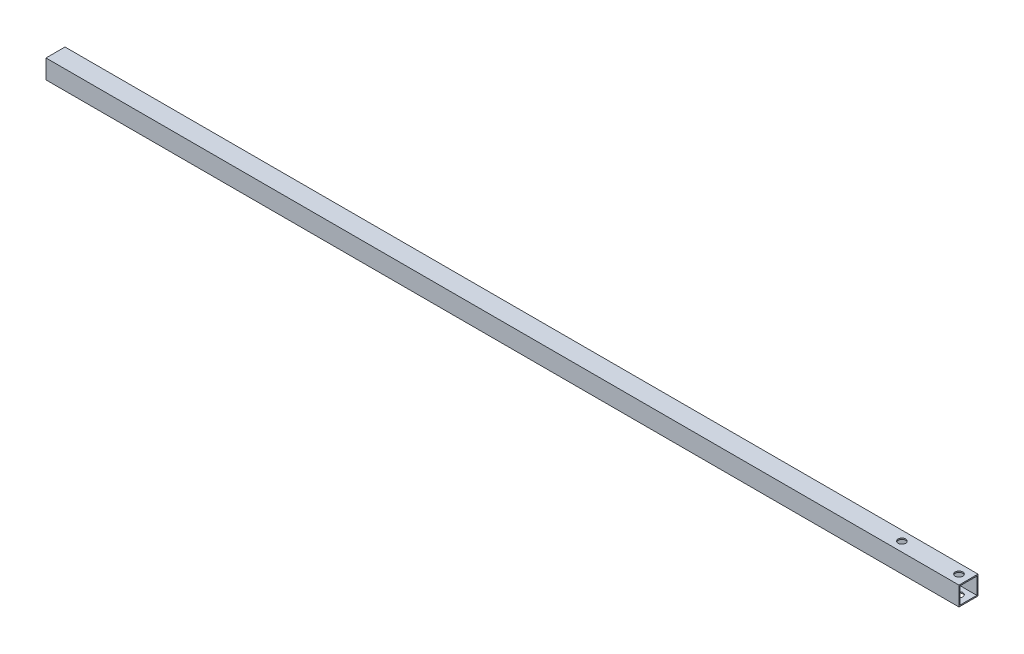
ISO-10303-21;
HEADER;
FILE_DESCRIPTION(('STEP AP214'),'2;1');
FILE_NAME('part.step','',(''),(''),'','','');
FILE_SCHEMA(('AUTOMOTIVE_DESIGN { 1 0 10303 214 1 1 1 1 }'));
ENDSEC;
DATA;
#1=APPLICATION_CONTEXT('core data for automotive mechanical design processes');
#2=APPLICATION_PROTOCOL_DEFINITION('international standard','automotive_design',2000,#1);
#3=PRODUCT_CONTEXT('',#1,'mechanical');
#4=PRODUCT('Part','Part','',(#3));
#5=PRODUCT_RELATED_PRODUCT_CATEGORY('part','',(#4));
#6=PRODUCT_DEFINITION_FORMATION('','',#4);
#7=PRODUCT_DEFINITION_CONTEXT('part definition',#1,'design');
#8=PRODUCT_DEFINITION('design','',#6,#7);
#9=PRODUCT_DEFINITION_SHAPE('','',#8);
#10=(LENGTH_UNIT() NAMED_UNIT(*) SI_UNIT(.MILLI.,.METRE.));
#11=(NAMED_UNIT(*) PLANE_ANGLE_UNIT() SI_UNIT($,.RADIAN.));
#12=(NAMED_UNIT(*) SI_UNIT($,.STERADIAN.) SOLID_ANGLE_UNIT());
#13=UNCERTAINTY_MEASURE_WITH_UNIT(LENGTH_MEASURE(1.E-05),#10,'distance_accuracy_value','');
#14=(GEOMETRIC_REPRESENTATION_CONTEXT(3) GLOBAL_UNCERTAINTY_ASSIGNED_CONTEXT((#13)) GLOBAL_UNIT_ASSIGNED_CONTEXT((#10,
#11,#12)) REPRESENTATION_CONTEXT('',''));
#15=CARTESIAN_POINT('',(0.,0.,0.));
#16=DIRECTION('',(0.,0.,1.));
#17=DIRECTION('',(1.,0.,0.));
#18=AXIS2_PLACEMENT_3D('',#15,#16,#17);
#19=CARTESIAN_POINT('',(1219.2,0.,0.));
#20=DIRECTION('',(-1.,0.,0.));
#21=DIRECTION('',(0.,0.,1.));
#22=AXIS2_PLACEMENT_3D('',#19,#20,#21);
#23=PLANE('',#22);
#24=DIRECTION('',(0.,1.,0.));
#25=VECTOR('',#24,1.);
#26=CARTESIAN_POINT('',(1219.2,-12.7,-12.7));
#27=LINE('',#26,#25);
#28=CARTESIAN_POINT('',(1219.2,-12.7,-12.7));
#29=VERTEX_POINT('',#28);
#30=CARTESIAN_POINT('',(1219.2,12.7,-12.7));
#31=VERTEX_POINT('',#30);
#32=EDGE_CURVE('E156',#29,#31,#27,.T.);
#33=ORIENTED_EDGE('',*,*,#32,.T.);
#34=DIRECTION('',(0.,0.,1.));
#35=VECTOR('',#34,1.);
#36=CARTESIAN_POINT('',(1219.2,12.7,12.7));
#37=LINE('',#36,#35);
#38=CARTESIAN_POINT('',(1219.2,12.7,12.7));
#39=VERTEX_POINT('',#38);
#40=EDGE_CURVE('E160',#31,#39,#37,.T.);
#41=ORIENTED_EDGE('',*,*,#40,.T.);
#42=DIRECTION('',(0.,-1.,0.));
#43=VECTOR('',#42,1.);
#44=CARTESIAN_POINT('',(1219.2,-12.7,12.7));
#45=LINE('',#44,#43);
#46=CARTESIAN_POINT('',(1219.2,-12.7,12.7));
#47=VERTEX_POINT('',#46);
#48=EDGE_CURVE('E164',#39,#47,#45,.T.);
#49=ORIENTED_EDGE('',*,*,#48,.T.);
#50=DIRECTION('',(0.,0.,-1.));
#51=VECTOR('',#50,1.);
#52=CARTESIAN_POINT('',(1219.2,-12.7,12.7));
#53=LINE('',#52,#51);
#54=EDGE_CURVE('E167',#47,#29,#53,.T.);
#55=ORIENTED_EDGE('',*,*,#54,.T.);
#56=EDGE_LOOP('',(#33,#41,#49,#55));
#57=FACE_BOUND('',#56,.T.);
#58=DIRECTION('',(0.,0.,-1.));
#59=VECTOR('',#58,1.);
#60=CARTESIAN_POINT('',(1219.2,-11.1125,11.1125));
#61=LINE('',#60,#59);
#62=CARTESIAN_POINT('',(1219.2,-11.1125,11.1125));
#63=VERTEX_POINT('',#62);
#64=CARTESIAN_POINT('',(1219.2,-11.1125,-11.1125));
#65=VERTEX_POINT('',#64);
#66=EDGE_CURVE('E106',#63,#65,#61,.T.);
#67=ORIENTED_EDGE('',*,*,#66,.F.);
#68=DIRECTION('',(0.,-1.,0.));
#69=VECTOR('',#68,1.);
#70=CARTESIAN_POINT('',(1219.2,-11.1125,11.1125));
#71=LINE('',#70,#69);
#72=CARTESIAN_POINT('',(1219.2,11.1125,11.1125));
#73=VERTEX_POINT('',#72);
#74=EDGE_CURVE('E132',#73,#63,#71,.T.);
#75=ORIENTED_EDGE('',*,*,#74,.F.);
#76=DIRECTION('',(0.,0.,1.));
#77=VECTOR('',#76,1.);
#78=CARTESIAN_POINT('',(1219.2,11.1125,11.1125));
#79=LINE('',#78,#77);
#80=CARTESIAN_POINT('',(1219.2,11.1125,-11.1125));
#81=VERTEX_POINT('',#80);
#82=EDGE_CURVE('E128',#81,#73,#79,.T.);
#83=ORIENTED_EDGE('',*,*,#82,.F.);
#84=DIRECTION('',(0.,1.,0.));
#85=VECTOR('',#84,1.);
#86=CARTESIAN_POINT('',(1219.2,-11.1125,-11.1125));
#87=LINE('',#86,#85);
#88=EDGE_CURVE('E115',#65,#81,#87,.T.);
#89=ORIENTED_EDGE('',*,*,#88,.F.);
#90=EDGE_LOOP('',(#67,#75,#83,#89));
#91=FACE_BOUND('',#90,.T.);
#92=ADVANCED_FACE('F39',(#57,#91),#23,.F.);
#93=CARTESIAN_POINT('',(0.,0.,0.));
#94=DIRECTION('',(-1.,0.,0.));
#95=DIRECTION('',(0.,0.,1.));
#96=AXIS2_PLACEMENT_3D('',#93,#94,#95);
#97=PLANE('',#96);
#98=DIRECTION('',(0.,1.,0.));
#99=VECTOR('',#98,1.);
#100=CARTESIAN_POINT('',(0.,-12.7,-12.7));
#101=LINE('',#100,#99);
#102=CARTESIAN_POINT('',(0.,-12.7,-12.7));
#103=VERTEX_POINT('',#102);
#104=CARTESIAN_POINT('',(0.,12.7,-12.7));
#105=VERTEX_POINT('',#104);
#106=EDGE_CURVE('E124',#103,#105,#101,.T.);
#107=ORIENTED_EDGE('',*,*,#106,.F.);
#108=DIRECTION('',(0.,0.,-1.));
#109=VECTOR('',#108,1.);
#110=CARTESIAN_POINT('',(0.,-12.7,12.7));
#111=LINE('',#110,#109);
#112=CARTESIAN_POINT('',(0.,-12.7,12.7));
#113=VERTEX_POINT('',#112);
#114=EDGE_CURVE('E161',#113,#103,#111,.T.);
#115=ORIENTED_EDGE('',*,*,#114,.F.);
#116=DIRECTION('',(0.,-1.,0.));
#117=VECTOR('',#116,1.);
#118=CARTESIAN_POINT('',(0.,-12.7,12.7));
#119=LINE('',#118,#117);
#120=CARTESIAN_POINT('',(0.,12.7,12.7));
#121=VERTEX_POINT('',#120);
#122=EDGE_CURVE('E177',#121,#113,#119,.T.);
#123=ORIENTED_EDGE('',*,*,#122,.F.);
#124=DIRECTION('',(0.,0.,1.));
#125=VECTOR('',#124,1.);
#126=CARTESIAN_POINT('',(0.,12.7,12.7));
#127=LINE('',#126,#125);
#128=EDGE_CURVE('E174',#105,#121,#127,.T.);
#129=ORIENTED_EDGE('',*,*,#128,.F.);
#130=EDGE_LOOP('',(#107,#115,#123,#129));
#131=FACE_BOUND('',#130,.T.);
#132=DIRECTION('',(0.,-1.,0.));
#133=VECTOR('',#132,1.);
#134=CARTESIAN_POINT('',(0.,-11.1125,11.1125));
#135=LINE('',#134,#133);
#136=CARTESIAN_POINT('',(0.,11.1125,11.1125));
#137=VERTEX_POINT('',#136);
#138=CARTESIAN_POINT('',(0.,-11.1125,11.1125));
#139=VERTEX_POINT('',#138);
#140=EDGE_CURVE('E116',#137,#139,#135,.T.);
#141=ORIENTED_EDGE('',*,*,#140,.T.);
#142=DIRECTION('',(0.,0.,-1.));
#143=VECTOR('',#142,1.);
#144=CARTESIAN_POINT('',(0.,-11.1125,11.1125));
#145=LINE('',#144,#143);
#146=CARTESIAN_POINT('',(0.,-11.1125,-11.1125));
#147=VERTEX_POINT('',#146);
#148=EDGE_CURVE('E64',#139,#147,#145,.T.);
#149=ORIENTED_EDGE('',*,*,#148,.T.);
#150=DIRECTION('',(0.,1.,0.));
#151=VECTOR('',#150,1.);
#152=CARTESIAN_POINT('',(0.,-11.1125,-11.1125));
#153=LINE('',#152,#151);
#154=CARTESIAN_POINT('',(0.,11.1125,-11.1125));
#155=VERTEX_POINT('',#154);
#156=EDGE_CURVE('E122',#147,#155,#153,.T.);
#157=ORIENTED_EDGE('',*,*,#156,.T.);
#158=DIRECTION('',(0.,0.,1.));
#159=VECTOR('',#158,1.);
#160=CARTESIAN_POINT('',(0.,11.1125,11.1125));
#161=LINE('',#160,#159);
#162=EDGE_CURVE('E143',#155,#137,#161,.T.);
#163=ORIENTED_EDGE('',*,*,#162,.T.);
#164=EDGE_LOOP('',(#141,#149,#157,#163));
#165=FACE_BOUND('',#164,.T.);
#166=ADVANCED_FACE('F201',(#131,#165),#97,.T.);
#167=CARTESIAN_POINT('',(1219.2,-12.7,-12.7));
#168=DIRECTION('',(0.,0.,1.));
#169=DIRECTION('',(1.,0.,0.));
#170=AXIS2_PLACEMENT_3D('',#167,#168,#169);
#171=PLANE('',#170);
#172=ORIENTED_EDGE('',*,*,#106,.T.);
#173=DIRECTION('',(-1.,0.,0.));
#174=VECTOR('',#173,1.);
#175=CARTESIAN_POINT('',(1219.2,12.7,-12.7));
#176=LINE('',#175,#174);
#177=EDGE_CURVE('E11',#31,#105,#176,.T.);
#178=ORIENTED_EDGE('',*,*,#177,.F.);
#179=ORIENTED_EDGE('',*,*,#32,.F.);
#180=DIRECTION('',(-1.,0.,0.));
#181=VECTOR('',#180,1.);
#182=CARTESIAN_POINT('',(1219.2,-12.7,-12.7));
#183=LINE('',#182,#181);
#184=EDGE_CURVE('E170',#29,#103,#183,.T.);
#185=ORIENTED_EDGE('',*,*,#184,.T.);
#186=EDGE_LOOP('',(#172,#178,#179,#185));
#187=FACE_BOUND('',#186,.T.);
#188=ADVANCED_FACE('F41',(#187),#171,.F.);
#189=CARTESIAN_POINT('',(1219.2,12.7,12.7));
#190=DIRECTION('',(0.,-1.,0.));
#191=DIRECTION('',(0.,0.,-1.));
#192=AXIS2_PLACEMENT_3D('',#189,#190,#191);
#193=PLANE('',#192);
#194=CARTESIAN_POINT('',(1206.5,12.7,0.));
#195=DIRECTION('',(0.,1.,0.));
#196=DIRECTION('',(0.,0.,1.));
#197=AXIS2_PLACEMENT_3D('',#194,#195,#196);
#198=CIRCLE('',#197,5.04189999999993);
#199=CARTESIAN_POINT('',(1206.5,12.7,5.04189999999993));
#200=VERTEX_POINT('',#199);
#201=EDGE_CURVE('E331',#200,#200,#198,.T.);
#202=ORIENTED_EDGE('',*,*,#201,.F.);
#203=EDGE_LOOP('',(#202));
#204=FACE_BOUND('',#203,.T.);
#205=CARTESIAN_POINT('',(1130.3,12.7,0.));
#206=DIRECTION('',(0.,1.,0.));
#207=DIRECTION('',(0.,0.,1.));
#208=AXIS2_PLACEMENT_3D('',#205,#206,#207);
#209=CIRCLE('',#208,5.04189999999993);
#210=CARTESIAN_POINT('',(1130.3,12.7,5.04189999999993));
#211=VERTEX_POINT('',#210);
#212=EDGE_CURVE('E246',#211,#211,#209,.T.);
#213=ORIENTED_EDGE('',*,*,#212,.F.);
#214=EDGE_LOOP('',(#213));
#215=FACE_BOUND('',#214,.T.);
#216=ORIENTED_EDGE('',*,*,#128,.T.);
#217=DIRECTION('',(-1.,0.,0.));
#218=VECTOR('',#217,1.);
#219=CARTESIAN_POINT('',(1219.2,12.7,12.7));
#220=LINE('',#219,#218);
#221=EDGE_CURVE('E49',#39,#121,#220,.T.);
#222=ORIENTED_EDGE('',*,*,#221,.F.);
#223=ORIENTED_EDGE('',*,*,#40,.F.);
#224=ORIENTED_EDGE('',*,*,#177,.T.);
#225=EDGE_LOOP('',(#216,#222,#223,#224));
#226=FACE_BOUND('',#225,.T.);
#227=ADVANCED_FACE('F211',(#204,#215,#226),#193,.F.);
#228=CARTESIAN_POINT('',(1219.2,-12.7,12.7));
#229=DIRECTION('',(0.,0.,-1.));
#230=DIRECTION('',(-1.,0.,0.));
#231=AXIS2_PLACEMENT_3D('',#228,#229,#230);
#232=PLANE('',#231);
#233=ORIENTED_EDGE('',*,*,#122,.T.);
#234=DIRECTION('',(-1.,0.,0.));
#235=VECTOR('',#234,1.);
#236=CARTESIAN_POINT('',(1219.2,-12.7,12.7));
#237=LINE('',#236,#235);
#238=EDGE_CURVE('E185',#47,#113,#237,.T.);
#239=ORIENTED_EDGE('',*,*,#238,.F.);
#240=ORIENTED_EDGE('',*,*,#48,.F.);
#241=ORIENTED_EDGE('',*,*,#221,.T.);
#242=EDGE_LOOP('',(#233,#239,#240,#241));
#243=FACE_BOUND('',#242,.T.);
#244=ADVANCED_FACE('F195',(#243),#232,.F.);
#245=CARTESIAN_POINT('',(1219.2,-12.7,12.7));
#246=DIRECTION('',(0.,1.,0.));
#247=DIRECTION('',(0.,0.,1.));
#248=AXIS2_PLACEMENT_3D('',#245,#246,#247);
#249=PLANE('',#248);
#250=CARTESIAN_POINT('',(1206.5,-12.7,0.));
#251=DIRECTION('',(0.,1.,0.));
#252=DIRECTION('',(0.,0.,1.));
#253=AXIS2_PLACEMENT_3D('',#250,#251,#252);
#254=CIRCLE('',#253,5.04189999999993);
#255=CARTESIAN_POINT('',(1206.5,-12.7,5.04189999999993));
#256=VERTEX_POINT('',#255);
#257=EDGE_CURVE('E239',#256,#256,#254,.T.);
#258=ORIENTED_EDGE('',*,*,#257,.T.);
#259=EDGE_LOOP('',(#258));
#260=FACE_BOUND('',#259,.T.);
#261=CARTESIAN_POINT('',(1130.3,-12.7,0.));
#262=DIRECTION('',(0.,1.,0.));
#263=DIRECTION('',(0.,0.,1.));
#264=AXIS2_PLACEMENT_3D('',#261,#262,#263);
#265=CIRCLE('',#264,5.04189999999993);
#266=CARTESIAN_POINT('',(1130.3,-12.7,5.04189999999993));
#267=VERTEX_POINT('',#266);
#268=EDGE_CURVE('E242',#267,#267,#265,.T.);
#269=ORIENTED_EDGE('',*,*,#268,.T.);
#270=EDGE_LOOP('',(#269));
#271=FACE_BOUND('',#270,.T.);
#272=ORIENTED_EDGE('',*,*,#114,.T.);
#273=ORIENTED_EDGE('',*,*,#184,.F.);
#274=ORIENTED_EDGE('',*,*,#54,.F.);
#275=ORIENTED_EDGE('',*,*,#238,.T.);
#276=EDGE_LOOP('',(#272,#273,#274,#275));
#277=FACE_BOUND('',#276,.T.);
#278=ADVANCED_FACE('F205',(#260,#271,#277),#249,.F.);
#279=CARTESIAN_POINT('',(1219.2,-11.1125,11.1125));
#280=DIRECTION('',(0.,1.,0.));
#281=DIRECTION('',(0.,0.,1.));
#282=AXIS2_PLACEMENT_3D('',#279,#280,#281);
#283=PLANE('',#282);
#284=CARTESIAN_POINT('',(1206.5,-11.1125,0.));
#285=DIRECTION('',(0.,1.,0.));
#286=DIRECTION('',(0.,0.,1.));
#287=AXIS2_PLACEMENT_3D('',#284,#285,#286);
#288=CIRCLE('',#287,5.04189999999993);
#289=CARTESIAN_POINT('',(1206.5,-11.1125,5.04189999999993));
#290=VERTEX_POINT('',#289);
#291=EDGE_CURVE('E253',#290,#290,#288,.T.);
#292=ORIENTED_EDGE('',*,*,#291,.F.);
#293=EDGE_LOOP('',(#292));
#294=FACE_BOUND('',#293,.T.);
#295=CARTESIAN_POINT('',(1130.3,-11.1125,0.));
#296=DIRECTION('',(0.,1.,0.));
#297=DIRECTION('',(0.,0.,1.));
#298=AXIS2_PLACEMENT_3D('',#295,#296,#297);
#299=CIRCLE('',#298,5.04189999999993);
#300=CARTESIAN_POINT('',(1130.3,-11.1125,5.04189999999993));
#301=VERTEX_POINT('',#300);
#302=EDGE_CURVE('E245',#301,#301,#299,.T.);
#303=ORIENTED_EDGE('',*,*,#302,.F.);
#304=EDGE_LOOP('',(#303));
#305=FACE_BOUND('',#304,.T.);
#306=ORIENTED_EDGE('',*,*,#148,.F.);
#307=DIRECTION('',(-1.,0.,0.));
#308=VECTOR('',#307,1.);
#309=CARTESIAN_POINT('',(1219.2,-11.1125,11.1125));
#310=LINE('',#309,#308);
#311=EDGE_CURVE('E110',#63,#139,#310,.T.);
#312=ORIENTED_EDGE('',*,*,#311,.F.);
#313=ORIENTED_EDGE('',*,*,#66,.T.);
#314=DIRECTION('',(-1.,0.,0.));
#315=VECTOR('',#314,1.);
#316=CARTESIAN_POINT('',(1219.2,-11.1125,-11.1125));
#317=LINE('',#316,#315);
#318=EDGE_CURVE('E109',#65,#147,#317,.T.);
#319=ORIENTED_EDGE('',*,*,#318,.T.);
#320=EDGE_LOOP('',(#306,#312,#313,#319));
#321=FACE_BOUND('',#320,.T.);
#322=ADVANCED_FACE('F108',(#294,#305,#321),#283,.T.);
#323=CARTESIAN_POINT('',(1219.2,-11.1125,-11.1125));
#324=DIRECTION('',(0.,0.,1.));
#325=DIRECTION('',(0.,-1.,0.));
#326=AXIS2_PLACEMENT_3D('',#323,#324,#325);
#327=PLANE('',#326);
#328=ORIENTED_EDGE('',*,*,#156,.F.);
#329=ORIENTED_EDGE('',*,*,#318,.F.);
#330=ORIENTED_EDGE('',*,*,#88,.T.);
#331=DIRECTION('',(-1.,0.,0.));
#332=VECTOR('',#331,1.);
#333=CARTESIAN_POINT('',(1219.2,11.1125,-11.1125));
#334=LINE('',#333,#332);
#335=EDGE_CURVE('E125',#81,#155,#334,.T.);
#336=ORIENTED_EDGE('',*,*,#335,.T.);
#337=EDGE_LOOP('',(#328,#329,#330,#336));
#338=FACE_BOUND('',#337,.T.);
#339=ADVANCED_FACE('F119',(#338),#327,.T.);
#340=CARTESIAN_POINT('',(1219.2,11.1125,11.1125));
#341=DIRECTION('',(0.,-1.,0.));
#342=DIRECTION('',(0.,0.,-1.));
#343=AXIS2_PLACEMENT_3D('',#340,#341,#342);
#344=PLANE('',#343);
#345=CARTESIAN_POINT('',(1206.5,11.1125,0.));
#346=DIRECTION('',(0.,-1.,0.));
#347=DIRECTION('',(0.,0.,-1.));
#348=AXIS2_PLACEMENT_3D('',#345,#346,#347);
#349=CIRCLE('',#348,5.04189999999993);
#350=CARTESIAN_POINT('',(1206.5,11.1125,-5.04189999999993));
#351=VERTEX_POINT('',#350);
#352=EDGE_CURVE('E43',#351,#351,#349,.T.);
#353=ORIENTED_EDGE('',*,*,#352,.F.);
#354=EDGE_LOOP('',(#353));
#355=FACE_BOUND('',#354,.T.);
#356=CARTESIAN_POINT('',(1130.3,11.1125,0.));
#357=DIRECTION('',(0.,-1.,0.));
#358=DIRECTION('',(0.,0.,-1.));
#359=AXIS2_PLACEMENT_3D('',#356,#357,#358);
#360=CIRCLE('',#359,5.04189999999993);
#361=CARTESIAN_POINT('',(1130.3,11.1125,-5.04189999999993));
#362=VERTEX_POINT('',#361);
#363=EDGE_CURVE('E140',#362,#362,#360,.T.);
#364=ORIENTED_EDGE('',*,*,#363,.F.);
#365=EDGE_LOOP('',(#364));
#366=FACE_BOUND('',#365,.T.);
#367=ORIENTED_EDGE('',*,*,#162,.F.);
#368=ORIENTED_EDGE('',*,*,#335,.F.);
#369=ORIENTED_EDGE('',*,*,#82,.T.);
#370=DIRECTION('',(-1.,0.,0.));
#371=VECTOR('',#370,1.);
#372=CARTESIAN_POINT('',(1219.2,11.1125,11.1125));
#373=LINE('',#372,#371);
#374=EDGE_CURVE('E56',#73,#137,#373,.T.);
#375=ORIENTED_EDGE('',*,*,#374,.T.);
#376=EDGE_LOOP('',(#367,#368,#369,#375));
#377=FACE_BOUND('',#376,.T.);
#378=ADVANCED_FACE('F263',(#355,#366,#377),#344,.T.);
#379=CARTESIAN_POINT('',(1219.2,-11.1125,11.1125));
#380=DIRECTION('',(0.,0.,-1.));
#381=DIRECTION('',(-1.,0.,0.));
#382=AXIS2_PLACEMENT_3D('',#379,#380,#381);
#383=PLANE('',#382);
#384=ORIENTED_EDGE('',*,*,#140,.F.);
#385=ORIENTED_EDGE('',*,*,#374,.F.);
#386=ORIENTED_EDGE('',*,*,#74,.T.);
#387=ORIENTED_EDGE('',*,*,#311,.T.);
#388=EDGE_LOOP('',(#384,#385,#386,#387));
#389=FACE_BOUND('',#388,.T.);
#390=ADVANCED_FACE('F266',(#389),#383,.T.);
#391=CARTESIAN_POINT('',(1130.3,12.7,0.));
#392=DIRECTION('',(0.,1.,0.));
#393=DIRECTION('',(0.,0.,1.));
#394=AXIS2_PLACEMENT_3D('',#391,#392,#393);
#395=CYLINDRICAL_SURFACE('',#394,5.04189999999993);
#396=ORIENTED_EDGE('',*,*,#363,.T.);
#397=EDGE_LOOP('',(#396));
#398=FACE_BOUND('',#397,.T.);
#399=ORIENTED_EDGE('',*,*,#212,.T.);
#400=EDGE_LOOP('',(#399));
#401=FACE_BOUND('',#400,.T.);
#402=ADVANCED_FACE('F260',(#398,#401),#395,.F.);
#403=ORIENTED_EDGE('',*,*,#302,.T.);
#404=EDGE_LOOP('',(#403));
#405=FACE_BOUND('',#404,.T.);
#406=ORIENTED_EDGE('',*,*,#268,.F.);
#407=EDGE_LOOP('',(#406));
#408=FACE_BOUND('',#407,.T.);
#409=ADVANCED_FACE('F275',(#405,#408),#395,.F.);
#410=CARTESIAN_POINT('',(1206.5,12.7,0.));
#411=DIRECTION('',(0.,1.,0.));
#412=DIRECTION('',(0.,0.,1.));
#413=AXIS2_PLACEMENT_3D('',#410,#411,#412);
#414=CYLINDRICAL_SURFACE('',#413,5.04189999999993);
#415=ORIENTED_EDGE('',*,*,#352,.T.);
#416=EDGE_LOOP('',(#415));
#417=FACE_BOUND('',#416,.T.);
#418=ORIENTED_EDGE('',*,*,#201,.T.);
#419=EDGE_LOOP('',(#418));
#420=FACE_BOUND('',#419,.T.);
#421=ADVANCED_FACE('F306',(#417,#420),#414,.F.);
#422=ORIENTED_EDGE('',*,*,#291,.T.);
#423=EDGE_LOOP('',(#422));
#424=FACE_BOUND('',#423,.T.);
#425=ORIENTED_EDGE('',*,*,#257,.F.);
#426=EDGE_LOOP('',(#425));
#427=FACE_BOUND('',#426,.T.);
#428=ADVANCED_FACE('F315',(#424,#427),#414,.F.);
#429=CLOSED_SHELL('',(#92,#166,#188,#227,#244,#278,#322,#339,#378,#390,#402,#409,#421,#428));
#430=MANIFOLD_SOLID_BREP('B2',#429);
#431=ADVANCED_BREP_SHAPE_REPRESENTATION('',(#18,#430),#14);
#432=SHAPE_DEFINITION_REPRESENTATION(#9,#431);
ENDSEC;
END-ISO-10303-21;
